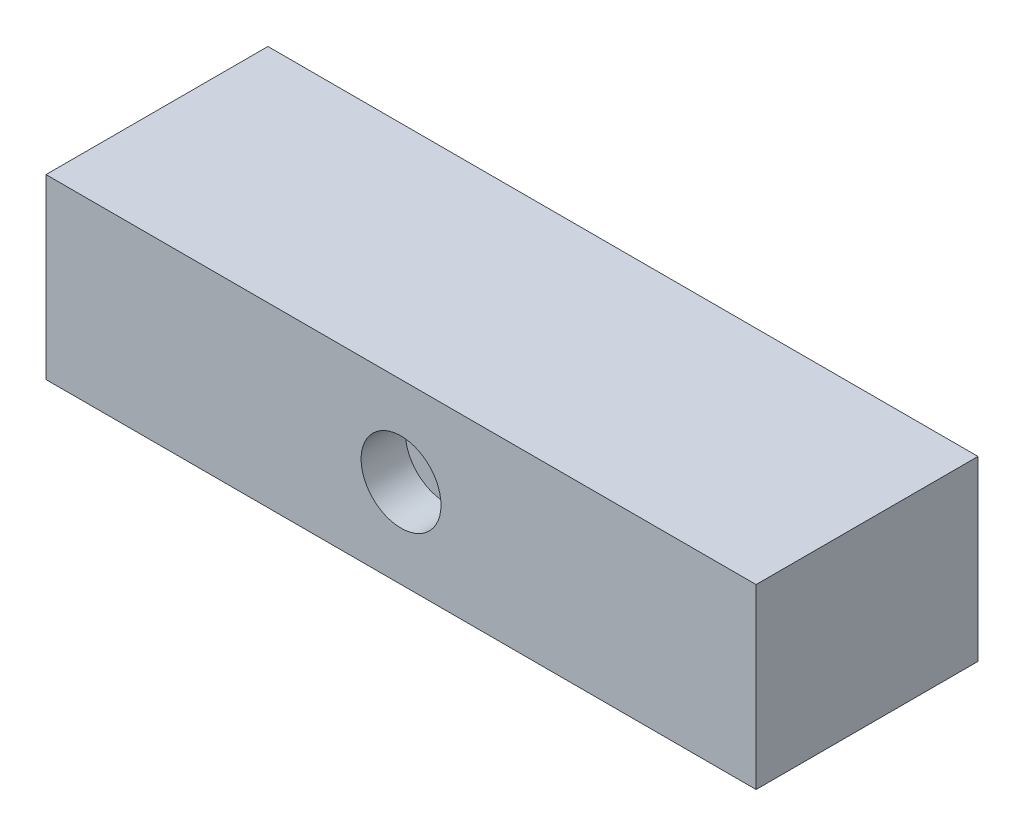
ISO-10303-21;
HEADER;
FILE_DESCRIPTION(('STEP AP214'),'2;1');
FILE_NAME('part.step','',(''),(''),'','','');
FILE_SCHEMA(('AUTOMOTIVE_DESIGN { 1 0 10303 214 1 1 1 1 }'));
ENDSEC;
DATA;
#1=APPLICATION_CONTEXT('core data for automotive mechanical design processes');
#2=APPLICATION_PROTOCOL_DEFINITION('international standard','automotive_design',2000,#1);
#3=PRODUCT_CONTEXT('',#1,'mechanical');
#4=PRODUCT('Part','Part','',(#3));
#5=PRODUCT_RELATED_PRODUCT_CATEGORY('part','',(#4));
#6=PRODUCT_DEFINITION_FORMATION('','',#4);
#7=PRODUCT_DEFINITION_CONTEXT('part definition',#1,'design');
#8=PRODUCT_DEFINITION('design','',#6,#7);
#9=PRODUCT_DEFINITION_SHAPE('','',#8);
#10=(LENGTH_UNIT() NAMED_UNIT(*) SI_UNIT(.MILLI.,.METRE.));
#11=(NAMED_UNIT(*) PLANE_ANGLE_UNIT() SI_UNIT($,.RADIAN.));
#12=(NAMED_UNIT(*) SI_UNIT($,.STERADIAN.) SOLID_ANGLE_UNIT());
#13=UNCERTAINTY_MEASURE_WITH_UNIT(LENGTH_MEASURE(1.E-05),#10,'distance_accuracy_value','');
#14=(GEOMETRIC_REPRESENTATION_CONTEXT(3) GLOBAL_UNCERTAINTY_ASSIGNED_CONTEXT((#13)) GLOBAL_UNIT_ASSIGNED_CONTEXT((#10,
#11,#12)) REPRESENTATION_CONTEXT('',''));
#15=CARTESIAN_POINT('',(0.,0.,0.));
#16=DIRECTION('',(0.,0.,1.));
#17=DIRECTION('',(1.,0.,0.));
#18=AXIS2_PLACEMENT_3D('',#15,#16,#17);
#19=CARTESIAN_POINT('',(-20.,5.,12.5));
#20=DIRECTION('',(0.,1.,0.));
#21=DIRECTION('',(0.,0.,1.));
#22=AXIS2_PLACEMENT_3D('',#19,#20,#21);
#23=PLANE('',#22);
#24=DIRECTION('',(1.,0.,0.));
#25=VECTOR('',#24,1.);
#26=CARTESIAN_POINT('',(-20.,5.,0.));
#27=LINE('',#26,#25);
#28=CARTESIAN_POINT('',(-20.,5.,0.));
#29=VERTEX_POINT('',#28);
#30=CARTESIAN_POINT('',(20.,5.,0.));
#31=VERTEX_POINT('',#30);
#32=EDGE_CURVE('E114',#29,#31,#27,.T.);
#33=ORIENTED_EDGE('',*,*,#32,.F.);
#34=DIRECTION('',(0.,0.,-1.));
#35=VECTOR('',#34,1.);
#36=CARTESIAN_POINT('',(-20.,5.,12.5));
#37=LINE('',#36,#35);
#38=CARTESIAN_POINT('',(-20.,5.,12.5));
#39=VERTEX_POINT('',#38);
#40=EDGE_CURVE('E11',#39,#29,#37,.T.);
#41=ORIENTED_EDGE('',*,*,#40,.F.);
#42=DIRECTION('',(1.,0.,0.));
#43=VECTOR('',#42,1.);
#44=CARTESIAN_POINT('',(-20.,5.,12.5));
#45=LINE('',#44,#43);
#46=CARTESIAN_POINT('',(20.,5.,12.5));
#47=VERTEX_POINT('',#46);
#48=EDGE_CURVE('E105',#39,#47,#45,.T.);
#49=ORIENTED_EDGE('',*,*,#48,.T.);
#50=DIRECTION('',(0.,0.,-1.));
#51=VECTOR('',#50,1.);
#52=CARTESIAN_POINT('',(20.,5.,12.5));
#53=LINE('',#52,#51);
#54=EDGE_CURVE('E46',#47,#31,#53,.T.);
#55=ORIENTED_EDGE('',*,*,#54,.T.);
#56=EDGE_LOOP('',(#33,#41,#49,#55));
#57=FACE_BOUND('',#56,.T.);
#58=ADVANCED_FACE('F43',(#57),#23,.T.);
#59=CARTESIAN_POINT('',(-20.,-5.,12.5));
#60=DIRECTION('',(-1.,0.,0.));
#61=DIRECTION('',(0.,0.,1.));
#62=AXIS2_PLACEMENT_3D('',#59,#60,#61);
#63=PLANE('',#62);
#64=DIRECTION('',(0.,1.,0.));
#65=VECTOR('',#64,1.);
#66=CARTESIAN_POINT('',(-20.,-5.,0.));
#67=LINE('',#66,#65);
#68=CARTESIAN_POINT('',(-20.,-5.,0.));
#69=VERTEX_POINT('',#68);
#70=EDGE_CURVE('E108',#69,#29,#67,.T.);
#71=ORIENTED_EDGE('',*,*,#70,.F.);
#72=DIRECTION('',(0.,0.,-1.));
#73=VECTOR('',#72,1.);
#74=CARTESIAN_POINT('',(-20.,-5.,12.5));
#75=LINE('',#74,#73);
#76=CARTESIAN_POINT('',(-20.,-5.,12.5));
#77=VERTEX_POINT('',#76);
#78=EDGE_CURVE('E53',#77,#69,#75,.T.);
#79=ORIENTED_EDGE('',*,*,#78,.F.);
#80=DIRECTION('',(0.,1.,0.));
#81=VECTOR('',#80,1.);
#82=CARTESIAN_POINT('',(-20.,-5.,12.5));
#83=LINE('',#82,#81);
#84=EDGE_CURVE('E92',#77,#39,#83,.T.);
#85=ORIENTED_EDGE('',*,*,#84,.T.);
#86=ORIENTED_EDGE('',*,*,#40,.T.);
#87=EDGE_LOOP('',(#71,#79,#85,#86));
#88=FACE_BOUND('',#87,.T.);
#89=ADVANCED_FACE('F131',(#88),#63,.T.);
#90=CARTESIAN_POINT('',(-20.,-5.,12.5));
#91=DIRECTION('',(0.,1.,0.));
#92=DIRECTION('',(0.,0.,1.));
#93=AXIS2_PLACEMENT_3D('',#90,#91,#92);
#94=PLANE('',#93);
#95=DIRECTION('',(1.,0.,0.));
#96=VECTOR('',#95,1.);
#97=CARTESIAN_POINT('',(-20.,-5.,0.));
#98=LINE('',#97,#96);
#99=CARTESIAN_POINT('',(20.,-5.,0.));
#100=VERTEX_POINT('',#99);
#101=EDGE_CURVE('E98',#69,#100,#98,.T.);
#102=ORIENTED_EDGE('',*,*,#101,.T.);
#103=DIRECTION('',(0.,0.,-1.));
#104=VECTOR('',#103,1.);
#105=CARTESIAN_POINT('',(20.,-5.,12.5));
#106=LINE('',#105,#104);
#107=CARTESIAN_POINT('',(20.,-5.,12.5));
#108=VERTEX_POINT('',#107);
#109=EDGE_CURVE('E96',#108,#100,#106,.T.);
#110=ORIENTED_EDGE('',*,*,#109,.F.);
#111=DIRECTION('',(1.,0.,0.));
#112=VECTOR('',#111,1.);
#113=CARTESIAN_POINT('',(-20.,-5.,12.5));
#114=LINE('',#113,#112);
#115=EDGE_CURVE('E89',#77,#108,#114,.T.);
#116=ORIENTED_EDGE('',*,*,#115,.F.);
#117=ORIENTED_EDGE('',*,*,#78,.T.);
#118=EDGE_LOOP('',(#102,#110,#116,#117));
#119=FACE_BOUND('',#118,.T.);
#120=ADVANCED_FACE('F97',(#119),#94,.F.);
#121=CARTESIAN_POINT('',(20.,-5.,12.5));
#122=DIRECTION('',(-1.,0.,0.));
#123=DIRECTION('',(0.,0.,1.));
#124=AXIS2_PLACEMENT_3D('',#121,#122,#123);
#125=PLANE('',#124);
#126=DIRECTION('',(0.,1.,0.));
#127=VECTOR('',#126,1.);
#128=CARTESIAN_POINT('',(20.,-5.,0.));
#129=LINE('',#128,#127);
#130=EDGE_CURVE('E118',#100,#31,#129,.T.);
#131=ORIENTED_EDGE('',*,*,#130,.T.);
#132=ORIENTED_EDGE('',*,*,#54,.F.);
#133=DIRECTION('',(0.,1.,0.));
#134=VECTOR('',#133,1.);
#135=CARTESIAN_POINT('',(20.,-5.,12.5));
#136=LINE('',#135,#134);
#137=EDGE_CURVE('E86',#108,#47,#136,.T.);
#138=ORIENTED_EDGE('',*,*,#137,.F.);
#139=ORIENTED_EDGE('',*,*,#109,.T.);
#140=EDGE_LOOP('',(#131,#132,#138,#139));
#141=FACE_BOUND('',#140,.T.);
#142=ADVANCED_FACE('F103',(#141),#125,.F.);
#143=CARTESIAN_POINT('',(0.,0.,12.5));
#144=DIRECTION('',(0.,0.,1.));
#145=DIRECTION('',(1.,0.,0.));
#146=AXIS2_PLACEMENT_3D('',#143,#144,#145);
#147=PLANE('',#146);
#148=CARTESIAN_POINT('',(0.,0.,12.5));
#149=DIRECTION('',(0.,0.,1.));
#150=DIRECTION('',(1.,0.,0.));
#151=AXIS2_PLACEMENT_3D('',#148,#149,#150);
#152=CIRCLE('',#151,2.25);
#153=CARTESIAN_POINT('',(2.25,0.,12.5));
#154=VERTEX_POINT('',#153);
#155=EDGE_CURVE('E163',#154,#154,#152,.T.);
#156=ORIENTED_EDGE('',*,*,#155,.F.);
#157=EDGE_LOOP('',(#156));
#158=FACE_BOUND('',#157,.T.);
#159=ORIENTED_EDGE('',*,*,#48,.F.);
#160=ORIENTED_EDGE('',*,*,#84,.F.);
#161=ORIENTED_EDGE('',*,*,#115,.T.);
#162=ORIENTED_EDGE('',*,*,#137,.T.);
#163=EDGE_LOOP('',(#159,#160,#161,#162));
#164=FACE_BOUND('',#163,.T.);
#165=ADVANCED_FACE('F91',(#158,#164),#147,.T.);
#166=CARTESIAN_POINT('',(0.,0.,0.));
#167=DIRECTION('',(0.,0.,1.));
#168=DIRECTION('',(1.,0.,0.));
#169=AXIS2_PLACEMENT_3D('',#166,#167,#168);
#170=PLANE('',#169);
#171=ORIENTED_EDGE('',*,*,#32,.T.);
#172=ORIENTED_EDGE('',*,*,#130,.F.);
#173=ORIENTED_EDGE('',*,*,#101,.F.);
#174=ORIENTED_EDGE('',*,*,#70,.T.);
#175=EDGE_LOOP('',(#171,#172,#173,#174));
#176=FACE_BOUND('',#175,.T.);
#177=ADVANCED_FACE('F130',(#176),#170,.F.);
#178=CARTESIAN_POINT('',(0.,0.,10.));
#179=DIRECTION('',(0.,0.,1.));
#180=DIRECTION('',(1.,0.,0.));
#181=AXIS2_PLACEMENT_3D('',#178,#179,#180);
#182=CYLINDRICAL_SURFACE('',#181,2.25);
#183=CARTESIAN_POINT('',(0.,0.,10.));
#184=DIRECTION('',(0.,0.,1.));
#185=DIRECTION('',(1.,0.,0.));
#186=AXIS2_PLACEMENT_3D('',#183,#184,#185);
#187=CIRCLE('',#186,2.25);
#188=CARTESIAN_POINT('',(2.25,0.,10.));
#189=VERTEX_POINT('',#188);
#190=EDGE_CURVE('E119',#189,#189,#187,.T.);
#191=ORIENTED_EDGE('',*,*,#190,.F.);
#192=EDGE_LOOP('',(#191));
#193=FACE_BOUND('',#192,.T.);
#194=ORIENTED_EDGE('',*,*,#155,.T.);
#195=EDGE_LOOP('',(#194));
#196=FACE_BOUND('',#195,.T.);
#197=ADVANCED_FACE('F149',(#193,#196),#182,.F.);
#198=CARTESIAN_POINT('',(0.,0.,10.));
#199=DIRECTION('',(0.,0.,1.));
#200=DIRECTION('',(1.,0.,0.));
#201=AXIS2_PLACEMENT_3D('',#198,#199,#200);
#202=PLANE('',#201);
#203=ORIENTED_EDGE('',*,*,#190,.T.);
#204=EDGE_LOOP('',(#203));
#205=FACE_BOUND('',#204,.T.);
#206=ADVANCED_FACE('F154',(#205),#202,.T.);
#207=CLOSED_SHELL('',(#58,#89,#120,#142,#165,#177,#197,#206));
#208=MANIFOLD_SOLID_BREP('B2',#207);
#209=ADVANCED_BREP_SHAPE_REPRESENTATION('',(#18,#208),#14);
#210=SHAPE_DEFINITION_REPRESENTATION(#9,#209);
ENDSEC;
END-ISO-10303-21;
